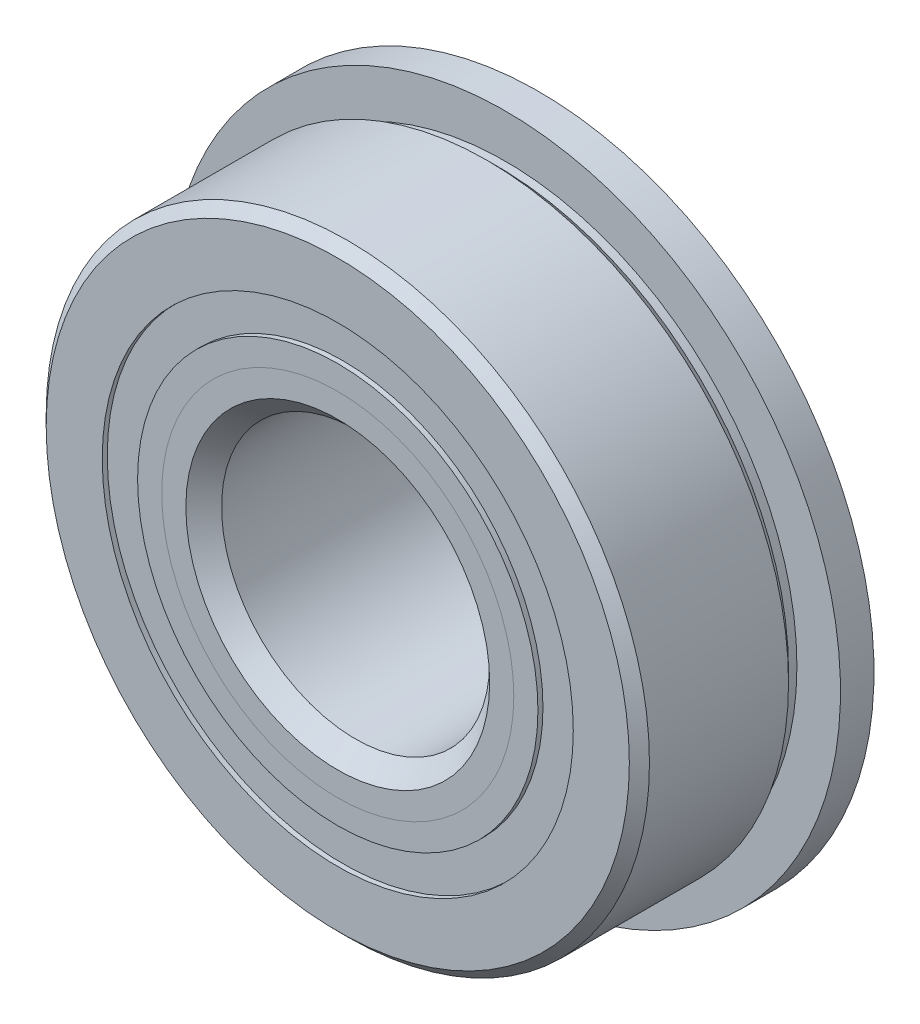
ISO-10303-21;
HEADER;
FILE_DESCRIPTION(('STEP AP214'),'2;1');
FILE_NAME('part.step','',(''),(''),'','','');
FILE_SCHEMA(('AUTOMOTIVE_DESIGN { 1 0 10303 214 1 1 1 1 }'));
ENDSEC;
DATA;
#1=APPLICATION_CONTEXT('core data for automotive mechanical design processes');
#2=APPLICATION_PROTOCOL_DEFINITION('international standard','automotive_design',2000,#1);
#3=PRODUCT_CONTEXT('',#1,'mechanical');
#4=PRODUCT('Part','Part','',(#3));
#5=PRODUCT_RELATED_PRODUCT_CATEGORY('part','',(#4));
#6=PRODUCT_DEFINITION_FORMATION('','',#4);
#7=PRODUCT_DEFINITION_CONTEXT('part definition',#1,'design');
#8=PRODUCT_DEFINITION('design','',#6,#7);
#9=PRODUCT_DEFINITION_SHAPE('','',#8);
#10=(LENGTH_UNIT() NAMED_UNIT(*) SI_UNIT(.MILLI.,.METRE.));
#11=(NAMED_UNIT(*) PLANE_ANGLE_UNIT() SI_UNIT($,.RADIAN.));
#12=(NAMED_UNIT(*) SI_UNIT($,.STERADIAN.) SOLID_ANGLE_UNIT());
#13=UNCERTAINTY_MEASURE_WITH_UNIT(LENGTH_MEASURE(1.E-05),#10,'distance_accuracy_value','');
#14=(GEOMETRIC_REPRESENTATION_CONTEXT(3) GLOBAL_UNCERTAINTY_ASSIGNED_CONTEXT((#13)) GLOBAL_UNIT_ASSIGNED_CONTEXT((#10,
#11,#12)) REPRESENTATION_CONTEXT('',''));
#15=CARTESIAN_POINT('',(0.,0.,0.));
#16=DIRECTION('',(0.,0.,1.));
#17=DIRECTION('',(1.,0.,0.));
#18=AXIS2_PLACEMENT_3D('',#15,#16,#17);
#19=CARTESIAN_POINT('',(0.,11.1561126373626,-4.524375));
#20=DIRECTION('',(0.,0.,1.));
#21=DIRECTION('',(1.,0.,0.));
#22=AXIS2_PLACEMENT_3D('',#19,#20,#21);
#23=PLANE('',#22);
#24=CARTESIAN_POINT('',(0.,0.,-4.524375));
#25=DIRECTION('',(0.,0.,1.));
#26=DIRECTION('',(1.,0.,0.));
#27=AXIS2_PLACEMENT_3D('',#24,#25,#26);
#28=CIRCLE('',#27,11.1561126373626);
#29=CARTESIAN_POINT('',(11.1561126373626,0.,-4.524375));
#30=VERTEX_POINT('',#29);
#31=EDGE_CURVE('E59',#30,#30,#28,.T.);
#32=ORIENTED_EDGE('',*,*,#31,.F.);
#33=EDGE_LOOP('',(#32));
#34=FACE_BOUND('',#33,.T.);
#35=CARTESIAN_POINT('',(0.,0.,-4.524375));
#36=DIRECTION('',(0.,0.,1.));
#37=DIRECTION('',(1.,0.,0.));
#38=AXIS2_PLACEMENT_3D('',#35,#36,#37);
#39=CIRCLE('',#38,9.48138736263736);
#40=CARTESIAN_POINT('',(9.48138736263736,0.,-4.524375));
#41=VERTEX_POINT('',#40);
#42=EDGE_CURVE('E11',#41,#41,#39,.T.);
#43=ORIENTED_EDGE('',*,*,#42,.T.);
#44=EDGE_LOOP('',(#43));
#45=FACE_BOUND('',#44,.T.);
#46=ADVANCED_FACE('F45',(#34,#45),#23,.F.);
#47=CARTESIAN_POINT('',(0.,0.,4.7625));
#48=DIRECTION('',(0.,0.,1.));
#49=DIRECTION('',(1.,0.,0.));
#50=AXIS2_PLACEMENT_3D('',#47,#48,#49);
#51=CYLINDRICAL_SURFACE('',#50,9.48138736263736);
#52=ORIENTED_EDGE('',*,*,#42,.F.);
#53=EDGE_LOOP('',(#52));
#54=FACE_BOUND('',#53,.T.);
#55=CARTESIAN_POINT('',(0.,0.,-2.27628073054021));
#56=DIRECTION('',(0.,0.,1.));
#57=DIRECTION('',(1.,0.,0.));
#58=AXIS2_PLACEMENT_3D('',#55,#56,#57);
#59=CIRCLE('',#58,9.48138736263736);
#60=CARTESIAN_POINT('',(9.48138736263736,0.,-2.27628073054021));
#61=VERTEX_POINT('',#60);
#62=EDGE_CURVE('E51',#61,#61,#59,.T.);
#63=ORIENTED_EDGE('',*,*,#62,.T.);
#64=EDGE_LOOP('',(#63));
#65=FACE_BOUND('',#64,.T.);
#66=ADVANCED_FACE('F68',(#54,#65),#51,.F.);
#67=CARTESIAN_POINT('',(0.,11.1561126373626,-2.27628073054021));
#68=DIRECTION('',(0.,0.,-1.));
#69=DIRECTION('',(-1.,0.,0.));
#70=AXIS2_PLACEMENT_3D('',#67,#68,#69);
#71=PLANE('',#70);
#72=ORIENTED_EDGE('',*,*,#62,.F.);
#73=EDGE_LOOP('',(#72));
#74=FACE_BOUND('',#73,.T.);
#75=CARTESIAN_POINT('',(0.,0.,-2.27628073054022));
#76=DIRECTION('',(0.,0.,1.));
#77=DIRECTION('',(1.,0.,0.));
#78=AXIS2_PLACEMENT_3D('',#75,#76,#77);
#79=CIRCLE('',#78,11.1561126373626);
#80=CARTESIAN_POINT('',(11.1561126373626,0.,-2.27628073054022));
#81=VERTEX_POINT('',#80);
#82=EDGE_CURVE('E55',#81,#81,#79,.T.);
#83=ORIENTED_EDGE('',*,*,#82,.T.);
#84=EDGE_LOOP('',(#83));
#85=FACE_BOUND('',#84,.T.);
#86=ADVANCED_FACE('F72',(#74,#85),#71,.F.);
#87=CARTESIAN_POINT('',(0.,0.,4.7625));
#88=DIRECTION('',(0.,0.,1.));
#89=DIRECTION('',(1.,0.,0.));
#90=AXIS2_PLACEMENT_3D('',#87,#88,#89);
#91=CYLINDRICAL_SURFACE('',#90,11.1561126373626);
#92=ORIENTED_EDGE('',*,*,#82,.F.);
#93=EDGE_LOOP('',(#92));
#94=FACE_BOUND('',#93,.T.);
#95=ORIENTED_EDGE('',*,*,#31,.T.);
#96=EDGE_LOOP('',(#95));
#97=FACE_BOUND('',#96,.T.);
#98=ADVANCED_FACE('F65',(#94,#97),#91,.T.);
#99=CLOSED_SHELL('',(#46,#66,#86,#98));
#100=MANIFOLD_SOLID_BREP('B2',#99);
#101=CARTESIAN_POINT('',(0.,11.1561126373626,4.524375));
#102=DIRECTION('',(0.,0.,-1.));
#103=DIRECTION('',(-1.,0.,0.));
#104=AXIS2_PLACEMENT_3D('',#101,#102,#103);
#105=PLANE('',#104);
#106=CARTESIAN_POINT('',(0.,0.,4.524375));
#107=DIRECTION('',(0.,0.,1.));
#108=DIRECTION('',(1.,0.,0.));
#109=AXIS2_PLACEMENT_3D('',#106,#107,#108);
#110=CIRCLE('',#109,9.48138736263736);
#111=CARTESIAN_POINT('',(9.48138736263736,0.,4.524375));
#112=VERTEX_POINT('',#111);
#113=EDGE_CURVE('E44',#112,#112,#110,.T.);
#114=ORIENTED_EDGE('',*,*,#113,.F.);
#115=EDGE_LOOP('',(#114));
#116=FACE_BOUND('',#115,.T.);
#117=CARTESIAN_POINT('',(0.,0.,4.524375));
#118=DIRECTION('',(0.,0.,1.));
#119=DIRECTION('',(1.,0.,0.));
#120=AXIS2_PLACEMENT_3D('',#117,#118,#119);
#121=CIRCLE('',#120,11.1561126373626);
#122=CARTESIAN_POINT('',(11.1561126373626,0.,4.524375));
#123=VERTEX_POINT('',#122);
#124=EDGE_CURVE('E126',#123,#123,#121,.T.);
#125=ORIENTED_EDGE('',*,*,#124,.T.);
#126=EDGE_LOOP('',(#125));
#127=FACE_BOUND('',#126,.T.);
#128=ADVANCED_FACE('F112',(#116,#127),#105,.F.);
#129=CARTESIAN_POINT('',(0.,0.,4.7625));
#130=DIRECTION('',(0.,0.,1.));
#131=DIRECTION('',(1.,0.,0.));
#132=AXIS2_PLACEMENT_3D('',#129,#130,#131);
#133=CYLINDRICAL_SURFACE('',#132,9.48138736263736);
#134=CARTESIAN_POINT('',(0.,0.,2.27628073054021));
#135=DIRECTION('',(0.,0.,1.));
#136=DIRECTION('',(1.,0.,0.));
#137=AXIS2_PLACEMENT_3D('',#134,#135,#136);
#138=CIRCLE('',#137,9.48138736263736);
#139=CARTESIAN_POINT('',(9.48138736263736,0.,2.27628073054021));
#140=VERTEX_POINT('',#139);
#141=EDGE_CURVE('E118',#140,#140,#138,.T.);
#142=ORIENTED_EDGE('',*,*,#141,.F.);
#143=EDGE_LOOP('',(#142));
#144=FACE_BOUND('',#143,.T.);
#145=ORIENTED_EDGE('',*,*,#113,.T.);
#146=EDGE_LOOP('',(#145));
#147=FACE_BOUND('',#146,.T.);
#148=ADVANCED_FACE('F141',(#144,#147),#133,.F.);
#149=CARTESIAN_POINT('',(0.,11.1561126373626,2.27628073054021));
#150=DIRECTION('',(0.,0.,1.));
#151=DIRECTION('',(1.,0.,0.));
#152=AXIS2_PLACEMENT_3D('',#149,#150,#151);
#153=PLANE('',#152);
#154=CARTESIAN_POINT('',(0.,0.,2.27628073054021));
#155=DIRECTION('',(0.,0.,1.));
#156=DIRECTION('',(1.,0.,0.));
#157=AXIS2_PLACEMENT_3D('',#154,#155,#156);
#158=CIRCLE('',#157,11.1561126373626);
#159=CARTESIAN_POINT('',(11.1561126373626,0.,2.27628073054021));
#160=VERTEX_POINT('',#159);
#161=EDGE_CURVE('E122',#160,#160,#158,.T.);
#162=ORIENTED_EDGE('',*,*,#161,.F.);
#163=EDGE_LOOP('',(#162));
#164=FACE_BOUND('',#163,.T.);
#165=ORIENTED_EDGE('',*,*,#141,.T.);
#166=EDGE_LOOP('',(#165));
#167=FACE_BOUND('',#166,.T.);
#168=ADVANCED_FACE('F136',(#164,#167),#153,.F.);
#169=CARTESIAN_POINT('',(0.,0.,4.7625));
#170=DIRECTION('',(0.,0.,1.));
#171=DIRECTION('',(1.,0.,0.));
#172=AXIS2_PLACEMENT_3D('',#169,#170,#171);
#173=CYLINDRICAL_SURFACE('',#172,11.1561126373626);
#174=ORIENTED_EDGE('',*,*,#124,.F.);
#175=EDGE_LOOP('',(#174));
#176=FACE_BOUND('',#175,.T.);
#177=ORIENTED_EDGE('',*,*,#161,.T.);
#178=EDGE_LOOP('',(#177));
#179=FACE_BOUND('',#178,.T.);
#180=ADVANCED_FACE('F133',(#176,#179),#173,.T.);
#181=CLOSED_SHELL('',(#128,#148,#168,#180));
#182=MANIFOLD_SOLID_BREP('B6',#181);
#183=CARTESIAN_POINT('',(-5.15937499999989,8.93629963530074,0.));
#184=DIRECTION('',(0.,0.,1.));
#185=DIRECTION('',(-0.499999999999989,0.866025403784445,0.));
#186=AXIS2_PLACEMENT_3D('',#183,#184,#185);
#187=SPHERICAL_SURFACE('',#186,2.27628073054021);
#188=CARTESIAN_POINT('',(-5.15937499999989,8.93629963530074,2.27628073054021));
#189=VERTEX_POINT('',#188);
#190=VERTEX_LOOP('',#189);
#191=FACE_BOUND('',#190,.T.);
#192=ADVANCED_FACE('F179',(#191),#187,.T.);
#193=CLOSED_SHELL('',(#192));
#194=MANIFOLD_SOLID_BREP('B39',#193);
#195=CARTESIAN_POINT('',(-8.93629963530062,5.1593750000001,0.));
#196=DIRECTION('',(0.,0.,1.));
#197=DIRECTION('',(-0.866025403784433,0.50000000000001,0.));
#198=AXIS2_PLACEMENT_3D('',#195,#196,#197);
#199=SPHERICAL_SURFACE('',#198,2.27628073054021);
#200=CARTESIAN_POINT('',(-8.93629963530062,5.1593750000001,2.27628073054021));
#201=VERTEX_POINT('',#200);
#202=VERTEX_LOOP('',#201);
#203=FACE_BOUND('',#202,.T.);
#204=ADVANCED_FACE('F211',(#203),#199,.T.);
#205=CLOSED_SHELL('',(#204));
#206=MANIFOLD_SOLID_BREP('B108',#205);
#207=CARTESIAN_POINT('',(-10.31875,1.08083231797342E-13,0.));
#208=DIRECTION('',(0.,0.,1.));
#209=DIRECTION('',(-1.,0.,0.));
#210=AXIS2_PLACEMENT_3D('',#207,#208,#209);
#211=SPHERICAL_SURFACE('',#210,2.27628073054021);
#212=CARTESIAN_POINT('',(-10.31875,1.08083231797342E-13,2.27628073054021));
#213=VERTEX_POINT('',#212);
#214=VERTEX_LOOP('',#213);
#215=FACE_BOUND('',#214,.T.);
#216=ADVANCED_FACE('F243',(#215),#211,.T.);
#217=CLOSED_SHELL('',(#216));
#218=MANIFOLD_SOLID_BREP('B175',#217);
#219=CARTESIAN_POINT('',(-8.93629963530072,-5.15937499999992,0.));
#220=DIRECTION('',(0.,0.,1.));
#221=DIRECTION('',(-0.866025403784443,-0.499999999999992,0.));
#222=AXIS2_PLACEMENT_3D('',#219,#220,#221);
#223=SPHERICAL_SURFACE('',#222,2.27628073054021);
#224=CARTESIAN_POINT('',(-8.93629963530072,-5.15937499999992,2.27628073054021));
#225=VERTEX_POINT('',#224);
#226=VERTEX_LOOP('',#225);
#227=FACE_BOUND('',#226,.T.);
#228=ADVANCED_FACE('F275',(#227),#223,.T.);
#229=CLOSED_SHELL('',(#228));
#230=MANIFOLD_SOLID_BREP('B207',#229);
#231=CARTESIAN_POINT('',(-5.15937500000007,-8.93629963530064,0.));
#232=DIRECTION('',(0.,0.,1.));
#233=DIRECTION('',(-0.500000000000007,-0.866025403784435,0.));
#234=AXIS2_PLACEMENT_3D('',#231,#232,#233);
#235=SPHERICAL_SURFACE('',#234,2.27628073054021);
#236=CARTESIAN_POINT('',(-5.15937500000007,-8.93629963530064,2.27628073054021));
#237=VERTEX_POINT('',#236);
#238=VERTEX_LOOP('',#237);
#239=FACE_BOUND('',#238,.T.);
#240=ADVANCED_FACE('F307',(#239),#235,.T.);
#241=CLOSED_SHELL('',(#240));
#242=MANIFOLD_SOLID_BREP('B239',#241);
#243=CARTESIAN_POINT('',(0.,-10.31875,0.));
#244=DIRECTION('',(0.,0.,1.));
#245=DIRECTION('',(0.,-1.,0.));
#246=AXIS2_PLACEMENT_3D('',#243,#244,#245);
#247=SPHERICAL_SURFACE('',#246,2.27628073054021);
#248=CARTESIAN_POINT('',(0.,-10.31875,2.27628073054021));
#249=VERTEX_POINT('',#248);
#250=VERTEX_LOOP('',#249);
#251=FACE_BOUND('',#250,.T.);
#252=ADVANCED_FACE('F339',(#251),#247,.T.);
#253=CLOSED_SHELL('',(#252));
#254=MANIFOLD_SOLID_BREP('B271',#253);
#255=CARTESIAN_POINT('',(5.15937499999995,-8.93629963530071,0.));
#256=DIRECTION('',(0.,0.,1.));
#257=DIRECTION('',(0.499999999999995,-0.866025403784442,0.));
#258=AXIS2_PLACEMENT_3D('',#255,#256,#257);
#259=SPHERICAL_SURFACE('',#258,2.27628073054021);
#260=CARTESIAN_POINT('',(5.15937499999995,-8.93629963530071,2.27628073054021));
#261=VERTEX_POINT('',#260);
#262=VERTEX_LOOP('',#261);
#263=FACE_BOUND('',#262,.T.);
#264=ADVANCED_FACE('F371',(#263),#259,.T.);
#265=CLOSED_SHELL('',(#264));
#266=MANIFOLD_SOLID_BREP('B303',#265);
#267=CARTESIAN_POINT('',(8.93629963530065,-5.15937500000004,0.));
#268=DIRECTION('',(0.,0.,1.));
#269=DIRECTION('',(0.866025403784436,-0.500000000000004,0.));
#270=AXIS2_PLACEMENT_3D('',#267,#268,#269);
#271=SPHERICAL_SURFACE('',#270,2.27628073054021);
#272=CARTESIAN_POINT('',(8.93629963530065,-5.15937500000004,2.27628073054021));
#273=VERTEX_POINT('',#272);
#274=VERTEX_LOOP('',#273);
#275=FACE_BOUND('',#274,.T.);
#276=ADVANCED_FACE('F403',(#275),#271,.T.);
#277=CLOSED_SHELL('',(#276));
#278=MANIFOLD_SOLID_BREP('B335',#277);
#279=CARTESIAN_POINT('',(10.31875,0.,0.));
#280=DIRECTION('',(0.,0.,1.));
#281=DIRECTION('',(1.,0.,0.));
#282=AXIS2_PLACEMENT_3D('',#279,#280,#281);
#283=SPHERICAL_SURFACE('',#282,2.27628073054021);
#284=CARTESIAN_POINT('',(10.31875,0.,2.27628073054021));
#285=VERTEX_POINT('',#284);
#286=VERTEX_LOOP('',#285);
#287=FACE_BOUND('',#286,.T.);
#288=ADVANCED_FACE('F435',(#287),#283,.T.);
#289=CLOSED_SHELL('',(#288));
#290=MANIFOLD_SOLID_BREP('B367',#289);
#291=CARTESIAN_POINT('',(8.93629963530069,5.15937499999998,0.));
#292=DIRECTION('',(0.,0.,1.));
#293=DIRECTION('',(0.86602540378444,0.499999999999998,0.));
#294=AXIS2_PLACEMENT_3D('',#291,#292,#293);
#295=SPHERICAL_SURFACE('',#294,2.27628073054021);
#296=CARTESIAN_POINT('',(8.93629963530069,5.15937499999998,2.27628073054021));
#297=VERTEX_POINT('',#296);
#298=VERTEX_LOOP('',#297);
#299=FACE_BOUND('',#298,.T.);
#300=ADVANCED_FACE('F467',(#299),#295,.T.);
#301=CLOSED_SHELL('',(#300));
#302=MANIFOLD_SOLID_BREP('B399',#301);
#303=CARTESIAN_POINT('',(5.15937500000001,8.93629963530067,0.));
#304=DIRECTION('',(0.,0.,1.));
#305=DIRECTION('',(0.500000000000001,0.866025403784438,0.));
#306=AXIS2_PLACEMENT_3D('',#303,#304,#305);
#307=SPHERICAL_SURFACE('',#306,2.27628073054021);
#308=CARTESIAN_POINT('',(5.15937500000001,8.93629963530067,2.27628073054021));
#309=VERTEX_POINT('',#308);
#310=VERTEX_LOOP('',#309);
#311=FACE_BOUND('',#310,.T.);
#312=ADVANCED_FACE('F499',(#311),#307,.T.);
#313=CLOSED_SHELL('',(#312));
#314=MANIFOLD_SOLID_BREP('B431',#313);
#315=CARTESIAN_POINT('',(0.,10.31875,0.));
#316=DIRECTION('',(0.,0.,1.));
#317=DIRECTION('',(0.,1.,0.));
#318=AXIS2_PLACEMENT_3D('',#315,#316,#317);
#319=SPHERICAL_SURFACE('',#318,2.27628073054021);
#320=CARTESIAN_POINT('',(0.,10.31875,2.27628073054021));
#321=VERTEX_POINT('',#320);
#322=VERTEX_LOOP('',#321);
#323=FACE_BOUND('',#322,.T.);
#324=ADVANCED_FACE('F533',(#323),#319,.T.);
#325=CLOSED_SHELL('',(#324));
#326=MANIFOLD_SOLID_BREP('B463',#325);
#327=CARTESIAN_POINT('',(0.,8.33881099868363,4.7625));
#328=DIRECTION('',(0.,0.,-1.));
#329=DIRECTION('',(-1.,0.,0.));
#330=AXIS2_PLACEMENT_3D('',#327,#328,#329);
#331=PLANE('',#330);
#332=CARTESIAN_POINT('',(0.,0.,4.7625));
#333=DIRECTION('',(0.,0.,1.));
#334=DIRECTION('',(1.,0.,0.));
#335=AXIS2_PLACEMENT_3D('',#332,#333,#334);
#336=CIRCLE('',#335,7.19623463472989);
#337=CARTESIAN_POINT('',(7.19623463472989,0.,4.7625));
#338=VERTEX_POINT('',#337);
#339=EDGE_CURVE('E587',#338,#338,#336,.T.);
#340=ORIENTED_EDGE('',*,*,#339,.F.);
#341=EDGE_LOOP('',(#340));
#342=FACE_BOUND('',#341,.T.);
#343=CARTESIAN_POINT('',(0.,0.,4.7625));
#344=DIRECTION('',(0.,0.,1.));
#345=DIRECTION('',(1.,0.,0.));
#346=AXIS2_PLACEMENT_3D('',#343,#344,#345);
#347=CIRCLE('',#346,8.33881099868363);
#348=CARTESIAN_POINT('',(8.33881099868363,0.,4.7625));
#349=VERTEX_POINT('',#348);
#350=EDGE_CURVE('E532',#349,#349,#347,.T.);
#351=ORIENTED_EDGE('',*,*,#350,.T.);
#352=EDGE_LOOP('',(#351));
#353=FACE_BOUND('',#352,.T.);
#354=ADVANCED_FACE('F553',(#342,#353),#331,.F.);
#355=CARTESIAN_POINT('',(0.,0.,3.61992363604627));
#356=DIRECTION('',(0.,0.,1.));
#357=DIRECTION('',(1.,0.,0.));
#358=AXIS2_PLACEMENT_3D('',#355,#356,#357);
#359=CONICAL_SURFACE('',#358,7.19623463472989,0.78539816339745);
#360=ORIENTED_EDGE('',*,*,#350,.F.);
#361=EDGE_LOOP('',(#360));
#362=FACE_BOUND('',#361,.T.);
#363=CARTESIAN_POINT('',(0.,0.,3.61992363604627));
#364=DIRECTION('',(0.,0.,1.));
#365=DIRECTION('',(1.,0.,0.));
#366=AXIS2_PLACEMENT_3D('',#363,#364,#365);
#367=CIRCLE('',#366,7.19623463472989);
#368=CARTESIAN_POINT('',(7.19623463472989,0.,3.61992363604627));
#369=VERTEX_POINT('',#368);
#370=EDGE_CURVE('E559',#369,#369,#367,.T.);
#371=ORIENTED_EDGE('',*,*,#370,.T.);
#372=EDGE_LOOP('',(#371));
#373=FACE_BOUND('',#372,.T.);
#374=ADVANCED_FACE('F594',(#362,#373),#359,.T.);
#375=CARTESIAN_POINT('',(0.,0.,4.7625));
#376=DIRECTION('',(0.,0.,1.));
#377=DIRECTION('',(1.,0.,0.));
#378=AXIS2_PLACEMENT_3D('',#375,#376,#377);
#379=CYLINDRICAL_SURFACE('',#378,7.19623463472989);
#380=ORIENTED_EDGE('',*,*,#370,.F.);
#381=EDGE_LOOP('',(#380));
#382=FACE_BOUND('',#381,.T.);
#383=CARTESIAN_POINT('',(0.,0.,0.));
#384=DIRECTION('',(0.,0.,1.));
#385=DIRECTION('',(1.,0.,0.));
#386=AXIS2_PLACEMENT_3D('',#383,#384,#385);
#387=CIRCLE('',#386,7.19623463472989);
#388=CARTESIAN_POINT('',(7.19623463472989,0.,0.));
#389=VERTEX_POINT('',#388);
#390=EDGE_CURVE('E563',#389,#389,#387,.T.);
#391=ORIENTED_EDGE('',*,*,#390,.T.);
#392=EDGE_LOOP('',(#391));
#393=FACE_BOUND('',#392,.T.);
#394=ADVANCED_FACE('F598',(#382,#393),#379,.T.);
#395=CARTESIAN_POINT('',(0.,7.19623463472989,0.));
#396=DIRECTION('',(0.,0.,-1.));
#397=DIRECTION('',(-1.,0.,0.));
#398=AXIS2_PLACEMENT_3D('',#395,#396,#397);
#399=PLANE('',#398);
#400=ORIENTED_EDGE('',*,*,#390,.F.);
#401=EDGE_LOOP('',(#400));
#402=FACE_BOUND('',#401,.T.);
#403=CARTESIAN_POINT('',(0.,0.,0.));
#404=DIRECTION('',(0.,0.,1.));
#405=DIRECTION('',(1.,0.,0.));
#406=AXIS2_PLACEMENT_3D('',#403,#404,#405);
#407=CIRCLE('',#406,8.04246926945979);
#408=CARTESIAN_POINT('',(8.04246926945979,0.,0.));
#409=VERTEX_POINT('',#408);
#410=EDGE_CURVE('E567',#409,#409,#407,.T.);
#411=ORIENTED_EDGE('',*,*,#410,.T.);
#412=EDGE_LOOP('',(#411));
#413=FACE_BOUND('',#412,.T.);
#414=ADVANCED_FACE('F603',(#402,#413),#399,.F.);
#415=CARTESIAN_POINT('',(0.,0.,0.));
#416=DIRECTION('',(0.,0.,1.));
#417=DIRECTION('',(1.,0.,0.));
#418=AXIS2_PLACEMENT_3D('',#415,#416,#417);
#419=TOROIDAL_SURFACE('',#418,10.31875,2.27628073054021);
#420=ORIENTED_EDGE('',*,*,#410,.F.);
#421=EDGE_LOOP('',(#420));
#422=FACE_BOUND('',#421,.T.);
#423=CARTESIAN_POINT('',(0.,0.,-2.11666666666667));
#424=DIRECTION('',(0.,0.,1.));
#425=DIRECTION('',(1.,0.,0.));
#426=AXIS2_PLACEMENT_3D('',#423,#424,#425);
#427=CIRCLE('',#426,9.48138736263736);
#428=CARTESIAN_POINT('',(9.48138736263736,0.,-2.11666666666667));
#429=VERTEX_POINT('',#428);
#430=EDGE_CURVE('E572',#429,#429,#427,.T.);
#431=ORIENTED_EDGE('',*,*,#430,.T.);
#432=EDGE_LOOP('',(#431));
#433=FACE_BOUND('',#432,.T.);
#434=ADVANCED_FACE('F609',(#422,#433),#419,.F.);
#435=CARTESIAN_POINT('',(0.,0.,4.7625));
#436=DIRECTION('',(0.,0.,1.));
#437=DIRECTION('',(1.,0.,0.));
#438=AXIS2_PLACEMENT_3D('',#435,#436,#437);
#439=CYLINDRICAL_SURFACE('',#438,9.48138736263736);
#440=ORIENTED_EDGE('',*,*,#430,.F.);
#441=EDGE_LOOP('',(#440));
#442=FACE_BOUND('',#441,.T.);
#443=CARTESIAN_POINT('',(0.,0.,-6.35));
#444=DIRECTION('',(0.,0.,1.));
#445=DIRECTION('',(1.,0.,0.));
#446=AXIS2_PLACEMENT_3D('',#443,#444,#445);
#447=CIRCLE('',#446,9.48138736263736);
#448=CARTESIAN_POINT('',(9.48138736263736,0.,-6.35));
#449=VERTEX_POINT('',#448);
#450=EDGE_CURVE('E575',#449,#449,#447,.T.);
#451=ORIENTED_EDGE('',*,*,#450,.T.);
#452=EDGE_LOOP('',(#451));
#453=FACE_BOUND('',#452,.T.);
#454=ADVANCED_FACE('F613',(#442,#453),#439,.T.);
#455=CARTESIAN_POINT('',(0.,6.82625,-6.35));
#456=DIRECTION('',(0.,0.,1.));
#457=DIRECTION('',(1.,0.,0.));
#458=AXIS2_PLACEMENT_3D('',#455,#456,#457);
#459=PLANE('',#458);
#460=ORIENTED_EDGE('',*,*,#450,.F.);
#461=EDGE_LOOP('',(#460));
#462=FACE_BOUND('',#461,.T.);
#463=CARTESIAN_POINT('',(0.,0.,-6.35));
#464=DIRECTION('',(0.,0.,1.));
#465=DIRECTION('',(1.,0.,0.));
#466=AXIS2_PLACEMENT_3D('',#463,#464,#465);
#467=CIRCLE('',#466,6.82625);
#468=CARTESIAN_POINT('',(6.82625,0.,-6.35));
#469=VERTEX_POINT('',#468);
#470=EDGE_CURVE('E578',#469,#469,#467,.T.);
#471=ORIENTED_EDGE('',*,*,#470,.T.);
#472=EDGE_LOOP('',(#471));
#473=FACE_BOUND('',#472,.T.);
#474=ADVANCED_FACE('F617',(#462,#473),#459,.F.);
#475=CARTESIAN_POINT('',(0.,0.,-5.87375));
#476=DIRECTION('',(0.,0.,-1.));
#477=DIRECTION('',(-1.,0.,0.));
#478=AXIS2_PLACEMENT_3D('',#475,#476,#477);
#479=CONICAL_SURFACE('',#478,6.35,0.785398163397447);
#480=ORIENTED_EDGE('',*,*,#470,.F.);
#481=EDGE_LOOP('',(#480));
#482=FACE_BOUND('',#481,.T.);
#483=CARTESIAN_POINT('',(0.,0.,-5.87375));
#484=DIRECTION('',(0.,0.,1.));
#485=DIRECTION('',(1.,0.,0.));
#486=AXIS2_PLACEMENT_3D('',#483,#484,#485);
#487=CIRCLE('',#486,6.35);
#488=CARTESIAN_POINT('',(6.35,0.,-5.87375));
#489=VERTEX_POINT('',#488);
#490=EDGE_CURVE('E581',#489,#489,#487,.T.);
#491=ORIENTED_EDGE('',*,*,#490,.T.);
#492=EDGE_LOOP('',(#491));
#493=FACE_BOUND('',#492,.T.);
#494=ADVANCED_FACE('F621',(#482,#493),#479,.F.);
#495=CARTESIAN_POINT('',(0.,0.,4.7625));
#496=DIRECTION('',(0.,0.,1.));
#497=DIRECTION('',(1.,0.,0.));
#498=AXIS2_PLACEMENT_3D('',#495,#496,#497);
#499=CYLINDRICAL_SURFACE('',#498,6.35);
#500=ORIENTED_EDGE('',*,*,#490,.F.);
#501=EDGE_LOOP('',(#500));
#502=FACE_BOUND('',#501,.T.);
#503=CARTESIAN_POINT('',(0.,0.,3.91626536527011));
#504=DIRECTION('',(0.,0.,1.));
#505=DIRECTION('',(1.,0.,0.));
#506=AXIS2_PLACEMENT_3D('',#503,#504,#505);
#507=CIRCLE('',#506,6.35);
#508=CARTESIAN_POINT('',(6.35,0.,3.91626536527011));
#509=VERTEX_POINT('',#508);
#510=EDGE_CURVE('E584',#509,#509,#507,.T.);
#511=ORIENTED_EDGE('',*,*,#510,.T.);
#512=EDGE_LOOP('',(#511));
#513=FACE_BOUND('',#512,.T.);
#514=ADVANCED_FACE('F625',(#502,#513),#499,.F.);
#515=CARTESIAN_POINT('',(0.,0.,4.7625));
#516=DIRECTION('',(0.,0.,1.));
#517=DIRECTION('',(1.,0.,0.));
#518=AXIS2_PLACEMENT_3D('',#515,#516,#517);
#519=CONICAL_SURFACE('',#518,7.19623463472989,0.785398163397448);
#520=ORIENTED_EDGE('',*,*,#510,.F.);
#521=EDGE_LOOP('',(#520));
#522=FACE_BOUND('',#521,.T.);
#523=ORIENTED_EDGE('',*,*,#339,.T.);
#524=EDGE_LOOP('',(#523));
#525=FACE_BOUND('',#524,.T.);
#526=ADVANCED_FACE('F591',(#522,#525),#519,.F.);
#527=CLOSED_SHELL('',(#354,#374,#394,#414,#434,#454,#474,#494,#514,#526));
#528=MANIFOLD_SOLID_BREP('B495',#527);
#529=CARTESIAN_POINT('',(0.,9.48138736263736,4.7625));
#530=DIRECTION('',(0.,0.,-1.));
#531=DIRECTION('',(-1.,0.,0.));
#532=AXIS2_PLACEMENT_3D('',#529,#530,#531);
#533=PLANE('',#532);
#534=CARTESIAN_POINT('',(0.,0.,4.7625));
#535=DIRECTION('',(0.,0.,1.));
#536=DIRECTION('',(1.,0.,0.));
#537=AXIS2_PLACEMENT_3D('',#534,#535,#536);
#538=CIRCLE('',#537,8.33881099868363);
#539=CARTESIAN_POINT('',(8.33881099868363,0.,4.7625));
#540=VERTEX_POINT('',#539);
#541=EDGE_CURVE('E552',#540,#540,#538,.T.);
#542=ORIENTED_EDGE('',*,*,#541,.F.);
#543=EDGE_LOOP('',(#542));
#544=FACE_BOUND('',#543,.T.);
#545=CARTESIAN_POINT('',(0.,0.,4.7625));
#546=DIRECTION('',(0.,0.,1.));
#547=DIRECTION('',(1.,0.,0.));
#548=AXIS2_PLACEMENT_3D('',#545,#546,#547);
#549=CIRCLE('',#548,9.48138736263736);
#550=CARTESIAN_POINT('',(9.48138736263736,0.,4.7625));
#551=VERTEX_POINT('',#550);
#552=EDGE_CURVE('E733',#551,#551,#549,.T.);
#553=ORIENTED_EDGE('',*,*,#552,.T.);
#554=EDGE_LOOP('',(#553));
#555=FACE_BOUND('',#554,.T.);
#556=ADVANCED_FACE('F711',(#544,#555),#533,.F.);
#557=CARTESIAN_POINT('',(0.,0.,4.7625));
#558=DIRECTION('',(0.,0.,1.));
#559=DIRECTION('',(1.,0.,0.));
#560=AXIS2_PLACEMENT_3D('',#557,#558,#559);
#561=CONICAL_SURFACE('',#560,8.33881099868363,0.78539816339745);
#562=CARTESIAN_POINT('',(0.,0.,3.61992363604627));
#563=DIRECTION('',(0.,0.,1.));
#564=DIRECTION('',(1.,0.,0.));
#565=AXIS2_PLACEMENT_3D('',#562,#563,#564);
#566=CIRCLE('',#565,7.19623463472989);
#567=CARTESIAN_POINT('',(7.19623463472989,0.,3.61992363604627));
#568=VERTEX_POINT('',#567);
#569=EDGE_CURVE('E717',#568,#568,#566,.T.);
#570=ORIENTED_EDGE('',*,*,#569,.F.);
#571=EDGE_LOOP('',(#570));
#572=FACE_BOUND('',#571,.T.);
#573=ORIENTED_EDGE('',*,*,#541,.T.);
#574=EDGE_LOOP('',(#573));
#575=FACE_BOUND('',#574,.T.);
#576=ADVANCED_FACE('F758',(#572,#575),#561,.F.);
#577=CARTESIAN_POINT('',(0.,0.,4.7625));
#578=DIRECTION('',(0.,0.,1.));
#579=DIRECTION('',(1.,0.,0.));
#580=AXIS2_PLACEMENT_3D('',#577,#578,#579);
#581=CYLINDRICAL_SURFACE('',#580,7.19623463472989);
#582=CARTESIAN_POINT('',(0.,0.,0.));
#583=DIRECTION('',(0.,0.,1.));
#584=DIRECTION('',(1.,0.,0.));
#585=AXIS2_PLACEMENT_3D('',#582,#583,#584);
#586=CIRCLE('',#585,7.19623463472989);
#587=CARTESIAN_POINT('',(7.19623463472989,0.,0.));
#588=VERTEX_POINT('',#587);
#589=EDGE_CURVE('E721',#588,#588,#586,.T.);
#590=ORIENTED_EDGE('',*,*,#589,.F.);
#591=EDGE_LOOP('',(#590));
#592=FACE_BOUND('',#591,.T.);
#593=ORIENTED_EDGE('',*,*,#569,.T.);
#594=EDGE_LOOP('',(#593));
#595=FACE_BOUND('',#594,.T.);
#596=ADVANCED_FACE('F753',(#592,#595),#581,.F.);
#597=CARTESIAN_POINT('',(0.,7.19623463472989,0.));
#598=DIRECTION('',(0.,0.,1.));
#599=DIRECTION('',(1.,0.,0.));
#600=AXIS2_PLACEMENT_3D('',#597,#598,#599);
#601=PLANE('',#600);
#602=CARTESIAN_POINT('',(0.,0.,0.));
#603=DIRECTION('',(0.,0.,1.));
#604=DIRECTION('',(1.,0.,0.));
#605=AXIS2_PLACEMENT_3D('',#602,#603,#604);
#606=CIRCLE('',#605,8.04246926945979);
#607=CARTESIAN_POINT('',(8.04246926945979,0.,0.));
#608=VERTEX_POINT('',#607);
#609=EDGE_CURVE('E725',#608,#608,#606,.T.);
#610=ORIENTED_EDGE('',*,*,#609,.F.);
#611=EDGE_LOOP('',(#610));
#612=FACE_BOUND('',#611,.T.);
#613=ORIENTED_EDGE('',*,*,#589,.T.);
#614=EDGE_LOOP('',(#613));
#615=FACE_BOUND('',#614,.T.);
#616=ADVANCED_FACE('F747',(#612,#615),#601,.F.);
#617=CARTESIAN_POINT('',(0.,0.,0.));
#618=DIRECTION('',(0.,0.,1.));
#619=DIRECTION('',(1.,0.,0.));
#620=AXIS2_PLACEMENT_3D('',#617,#618,#619);
#621=TOROIDAL_SURFACE('',#620,10.31875,2.27628073054021);
#622=CARTESIAN_POINT('',(0.,0.,2.11666666666667));
#623=DIRECTION('',(0.,0.,1.));
#624=DIRECTION('',(1.,0.,0.));
#625=AXIS2_PLACEMENT_3D('',#622,#623,#624);
#626=CIRCLE('',#625,9.48138736263736);
#627=CARTESIAN_POINT('',(9.48138736263736,0.,2.11666666666667));
#628=VERTEX_POINT('',#627);
#629=EDGE_CURVE('E730',#628,#628,#626,.T.);
#630=ORIENTED_EDGE('',*,*,#629,.F.);
#631=EDGE_LOOP('',(#630));
#632=FACE_BOUND('',#631,.T.);
#633=ORIENTED_EDGE('',*,*,#609,.T.);
#634=EDGE_LOOP('',(#633));
#635=FACE_BOUND('',#634,.T.);
#636=ADVANCED_FACE('F741',(#632,#635),#621,.F.);
#637=CARTESIAN_POINT('',(0.,0.,4.7625));
#638=DIRECTION('',(0.,0.,1.));
#639=DIRECTION('',(1.,0.,0.));
#640=AXIS2_PLACEMENT_3D('',#637,#638,#639);
#641=CYLINDRICAL_SURFACE('',#640,9.48138736263736);
#642=ORIENTED_EDGE('',*,*,#552,.F.);
#643=EDGE_LOOP('',(#642));
#644=FACE_BOUND('',#643,.T.);
#645=ORIENTED_EDGE('',*,*,#629,.T.);
#646=EDGE_LOOP('',(#645));
#647=FACE_BOUND('',#646,.T.);
#648=ADVANCED_FACE('F738',(#644,#647),#641,.T.);
#649=CLOSED_SHELL('',(#556,#576,#596,#616,#636,#648));
#650=MANIFOLD_SOLID_BREP('B527',#649);
#651=CARTESIAN_POINT('',(0.,0.,4.7625));
#652=DIRECTION('',(0.,0.,1.));
#653=DIRECTION('',(1.,0.,0.));
#654=AXIS2_PLACEMENT_3D('',#651,#652,#653);
#655=CYLINDRICAL_SURFACE('',#654,14.2875);
#656=CARTESIAN_POINT('',(0.,0.,4.28625));
#657=DIRECTION('',(0.,0.,1.));
#658=DIRECTION('',(1.,0.,0.));
#659=AXIS2_PLACEMENT_3D('',#656,#657,#658);
#660=CIRCLE('',#659,14.2875);
#661=CARTESIAN_POINT('',(14.2875,0.,4.28625));
#662=VERTEX_POINT('',#661);
#663=EDGE_CURVE('E710',#662,#662,#660,.T.);
#664=ORIENTED_EDGE('',*,*,#663,.F.);
#665=EDGE_LOOP('',(#664));
#666=FACE_BOUND('',#665,.T.);
#667=CARTESIAN_POINT('',(0.,0.,-2.301875));
#668=DIRECTION('',(0.,0.,1.));
#669=DIRECTION('',(1.,0.,0.));
#670=AXIS2_PLACEMENT_3D('',#667,#668,#669);
#671=CIRCLE('',#670,14.2875);
#672=CARTESIAN_POINT('',(14.2875,0.,-2.301875));
#673=VERTEX_POINT('',#672);
#674=EDGE_CURVE('E840',#673,#673,#671,.T.);
#675=ORIENTED_EDGE('',*,*,#674,.T.);
#676=EDGE_LOOP('',(#675));
#677=FACE_BOUND('',#676,.T.);
#678=ADVANCED_FACE('F802',(#666,#677),#655,.T.);
#679=CARTESIAN_POINT('',(0.,0.,4.28625));
#680=DIRECTION('',(0.,0.,-1.));
#681=DIRECTION('',(-1.,0.,0.));
#682=AXIS2_PLACEMENT_3D('',#679,#680,#681);
#683=CONICAL_SURFACE('',#682,14.2875,0.785398163397447);
#684=CARTESIAN_POINT('',(0.,0.,4.7625));
#685=DIRECTION('',(0.,0.,1.));
#686=DIRECTION('',(1.,0.,0.));
#687=AXIS2_PLACEMENT_3D('',#684,#685,#686);
#688=CIRCLE('',#687,13.81125);
#689=CARTESIAN_POINT('',(13.81125,0.,4.7625));
#690=VERTEX_POINT('',#689);
#691=EDGE_CURVE('E825',#690,#690,#688,.T.);
#692=ORIENTED_EDGE('',*,*,#691,.F.);
#693=EDGE_LOOP('',(#692));
#694=FACE_BOUND('',#693,.T.);
#695=ORIENTED_EDGE('',*,*,#663,.T.);
#696=EDGE_LOOP('',(#695));
#697=FACE_BOUND('',#696,.T.);
#698=ADVANCED_FACE('F804',(#694,#697),#683,.T.);
#699=CARTESIAN_POINT('',(0.,13.81125,-4.7625));
#700=DIRECTION('',(0.,0.,1.));
#701=DIRECTION('',(1.,0.,0.));
#702=AXIS2_PLACEMENT_3D('',#699,#700,#701);
#703=PLANE('',#702);
#704=CARTESIAN_POINT('',(0.,0.,-4.7625));
#705=DIRECTION('',(0.,0.,1.));
#706=DIRECTION('',(1.,0.,0.));
#707=AXIS2_PLACEMENT_3D('',#704,#705,#706);
#708=CIRCLE('',#707,11.1561126373626);
#709=CARTESIAN_POINT('',(11.1561126373626,0.,-4.7625));
#710=VERTEX_POINT('',#709);
#711=EDGE_CURVE('E809',#710,#710,#708,.T.);
#712=ORIENTED_EDGE('',*,*,#711,.T.);
#713=EDGE_LOOP('',(#712));
#714=FACE_BOUND('',#713,.T.);
#715=CARTESIAN_POINT('',(0.,0.,-4.7625));
#716=DIRECTION('',(0.,0.,-1.));
#717=DIRECTION('',(-1.,0.,0.));
#718=AXIS2_PLACEMENT_3D('',#715,#716,#717);
#719=CIRCLE('',#718,15.875);
#720=CARTESIAN_POINT('',(-15.875,0.,-4.7625));
#721=VERTEX_POINT('',#720);
#722=EDGE_CURVE('E828',#721,#721,#719,.T.);
#723=ORIENTED_EDGE('',*,*,#722,.T.);
#724=EDGE_LOOP('',(#723));
#725=FACE_BOUND('',#724,.T.);
#726=ADVANCED_FACE('F861',(#714,#725),#703,.F.);
#727=CARTESIAN_POINT('',(0.,0.,4.7625));
#728=DIRECTION('',(0.,0.,1.));
#729=DIRECTION('',(1.,0.,0.));
#730=AXIS2_PLACEMENT_3D('',#727,#728,#729);
#731=CYLINDRICAL_SURFACE('',#730,11.1561126373626);
#732=ORIENTED_EDGE('',*,*,#711,.F.);
#733=EDGE_LOOP('',(#732));
#734=FACE_BOUND('',#733,.T.);
#735=CARTESIAN_POINT('',(0.,0.,-2.11666666666667));
#736=DIRECTION('',(0.,0.,1.));
#737=DIRECTION('',(1.,0.,0.));
#738=AXIS2_PLACEMENT_3D('',#735,#736,#737);
#739=CIRCLE('',#738,11.1561126373626);
#740=CARTESIAN_POINT('',(11.1561126373626,0.,-2.11666666666667));
#741=VERTEX_POINT('',#740);
#742=EDGE_CURVE('E813',#741,#741,#739,.T.);
#743=ORIENTED_EDGE('',*,*,#742,.T.);
#744=EDGE_LOOP('',(#743));
#745=FACE_BOUND('',#744,.T.);
#746=ADVANCED_FACE('F866',(#734,#745),#731,.F.);
#747=CARTESIAN_POINT('',(0.,0.,0.));
#748=DIRECTION('',(0.,0.,1.));
#749=DIRECTION('',(1.,0.,0.));
#750=AXIS2_PLACEMENT_3D('',#747,#748,#749);
#751=TOROIDAL_SURFACE('',#750,10.31875,2.27628073054021);
#752=ORIENTED_EDGE('',*,*,#742,.F.);
#753=EDGE_LOOP('',(#752));
#754=FACE_BOUND('',#753,.T.);
#755=CARTESIAN_POINT('',(0.,0.,2.11666666666667));
#756=DIRECTION('',(0.,0.,1.));
#757=DIRECTION('',(1.,0.,0.));
#758=AXIS2_PLACEMENT_3D('',#755,#756,#757);
#759=CIRCLE('',#758,11.1561126373626);
#760=CARTESIAN_POINT('',(11.1561126373626,0.,2.11666666666667));
#761=VERTEX_POINT('',#760);
#762=EDGE_CURVE('E817',#761,#761,#759,.T.);
#763=ORIENTED_EDGE('',*,*,#762,.T.);
#764=EDGE_LOOP('',(#763));
#765=FACE_BOUND('',#764,.T.);
#766=ADVANCED_FACE('F869',(#754,#765),#751,.F.);
#767=CARTESIAN_POINT('',(0.,0.,4.7625));
#768=DIRECTION('',(0.,0.,1.));
#769=DIRECTION('',(1.,0.,0.));
#770=AXIS2_PLACEMENT_3D('',#767,#768,#769);
#771=CYLINDRICAL_SURFACE('',#770,11.1561126373626);
#772=ORIENTED_EDGE('',*,*,#762,.F.);
#773=EDGE_LOOP('',(#772));
#774=FACE_BOUND('',#773,.T.);
#775=CARTESIAN_POINT('',(0.,0.,4.7625));
#776=DIRECTION('',(0.,0.,1.));
#777=DIRECTION('',(1.,0.,0.));
#778=AXIS2_PLACEMENT_3D('',#775,#776,#777);
#779=CIRCLE('',#778,11.1561126373626);
#780=CARTESIAN_POINT('',(11.1561126373626,0.,4.7625));
#781=VERTEX_POINT('',#780);
#782=EDGE_CURVE('E822',#781,#781,#779,.T.);
#783=ORIENTED_EDGE('',*,*,#782,.T.);
#784=EDGE_LOOP('',(#783));
#785=FACE_BOUND('',#784,.T.);
#786=ADVANCED_FACE('F873',(#774,#785),#771,.F.);
#787=CARTESIAN_POINT('',(0.,13.81125,4.7625));
#788=DIRECTION('',(0.,0.,-1.));
#789=DIRECTION('',(-1.,0.,0.));
#790=AXIS2_PLACEMENT_3D('',#787,#788,#789);
#791=PLANE('',#790);
#792=ORIENTED_EDGE('',*,*,#782,.F.);
#793=EDGE_LOOP('',(#792));
#794=FACE_BOUND('',#793,.T.);
#795=ORIENTED_EDGE('',*,*,#691,.T.);
#796=EDGE_LOOP('',(#795));
#797=FACE_BOUND('',#796,.T.);
#798=ADVANCED_FACE('F877',(#794,#797),#791,.F.);
#799=CARTESIAN_POINT('',(0.,12.4836813186813,-3.175));
#800=DIRECTION('',(0.,0.,1.));
#801=DIRECTION('',(1.,0.,0.));
#802=AXIS2_PLACEMENT_3D('',#799,#800,#801);
#803=PLANE('',#802);
#804=CARTESIAN_POINT('',(0.,0.,-3.175));
#805=DIRECTION('',(0.,0.,-1.));
#806=DIRECTION('',(-1.,0.,0.));
#807=AXIS2_PLACEMENT_3D('',#804,#805,#806);
#808=CIRCLE('',#807,15.875);
#809=CARTESIAN_POINT('',(-15.875,0.,-3.175));
#810=VERTEX_POINT('',#809);
#811=EDGE_CURVE('E831',#810,#810,#808,.T.);
#812=ORIENTED_EDGE('',*,*,#811,.F.);
#813=EDGE_LOOP('',(#812));
#814=FACE_BOUND('',#813,.T.);
#815=CARTESIAN_POINT('',(0.,0.,-3.175));
#816=DIRECTION('',(0.,0.,1.));
#817=DIRECTION('',(1.,0.,0.));
#818=AXIS2_PLACEMENT_3D('',#815,#816,#817);
#819=CIRCLE('',#818,13.81125);
#820=CARTESIAN_POINT('',(13.81125,0.,-3.175));
#821=VERTEX_POINT('',#820);
#822=EDGE_CURVE('E834',#821,#821,#819,.T.);
#823=ORIENTED_EDGE('',*,*,#822,.F.);
#824=EDGE_LOOP('',(#823));
#825=FACE_BOUND('',#824,.T.);
#826=ADVANCED_FACE('F881',(#814,#825),#803,.T.);
#827=CARTESIAN_POINT('',(0.,0.,-6.35));
#828=DIRECTION('',(0.,0.,-1.));
#829=DIRECTION('',(-1.,0.,0.));
#830=AXIS2_PLACEMENT_3D('',#827,#828,#829);
#831=CYLINDRICAL_SURFACE('',#830,15.875);
#832=ORIENTED_EDGE('',*,*,#811,.T.);
#833=EDGE_LOOP('',(#832));
#834=FACE_BOUND('',#833,.T.);
#835=ORIENTED_EDGE('',*,*,#722,.F.);
#836=EDGE_LOOP('',(#835));
#837=FACE_BOUND('',#836,.T.);
#838=ADVANCED_FACE('F853',(#834,#837),#831,.T.);
#839=CARTESIAN_POINT('',(0.,0.,4.7625));
#840=DIRECTION('',(0.,0.,1.));
#841=DIRECTION('',(1.,0.,0.));
#842=AXIS2_PLACEMENT_3D('',#839,#840,#841);
#843=CYLINDRICAL_SURFACE('',#842,13.81125);
#844=ORIENTED_EDGE('',*,*,#822,.T.);
#845=EDGE_LOOP('',(#844));
#846=FACE_BOUND('',#845,.T.);
#847=CARTESIAN_POINT('',(0.,0.,-2.778125));
#848=DIRECTION('',(0.,0.,1.));
#849=DIRECTION('',(1.,0.,0.));
#850=AXIS2_PLACEMENT_3D('',#847,#848,#849);
#851=CIRCLE('',#850,13.81125);
#852=CARTESIAN_POINT('',(13.81125,0.,-2.778125));
#853=VERTEX_POINT('',#852);
#854=EDGE_CURVE('E837',#853,#853,#851,.T.);
#855=ORIENTED_EDGE('',*,*,#854,.F.);
#856=EDGE_LOOP('',(#855));
#857=FACE_BOUND('',#856,.T.);
#858=ADVANCED_FACE('F847',(#846,#857),#843,.T.);
#859=CARTESIAN_POINT('',(0.,0.,-2.301875));
#860=DIRECTION('',(0.,0.,1.));
#861=DIRECTION('',(1.,0.,0.));
#862=AXIS2_PLACEMENT_3D('',#859,#860,#861);
#863=CONICAL_SURFACE('',#862,14.2875,0.785398163397445);
#864=ORIENTED_EDGE('',*,*,#854,.T.);
#865=EDGE_LOOP('',(#864));
#866=FACE_BOUND('',#865,.T.);
#867=ORIENTED_EDGE('',*,*,#674,.F.);
#868=EDGE_LOOP('',(#867));
#869=FACE_BOUND('',#868,.T.);
#870=ADVANCED_FACE('F845',(#866,#869),#863,.T.);
#871=CLOSED_SHELL('',(#678,#698,#726,#746,#766,#786,#798,#826,#838,#858,#870));
#872=MANIFOLD_SOLID_BREP('B547',#871);
#873=ADVANCED_BREP_SHAPE_REPRESENTATION('',(#18,#100,#182,#194,#206,#218,#230,#242,#254,#266,
#278,#290,#302,#314,#326,#528,#650,#872),#14);
#874=SHAPE_DEFINITION_REPRESENTATION(#9,#873);
ENDSEC;
END-ISO-10303-21;
